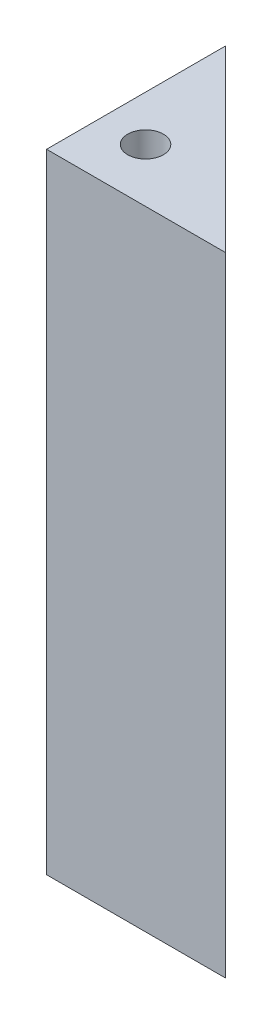
ISO-10303-21;
HEADER;
FILE_DESCRIPTION(('STEP AP214'),'2;1');
FILE_NAME('part.step','',(''),(''),'','','');
FILE_SCHEMA(('AUTOMOTIVE_DESIGN { 1 0 10303 214 1 1 1 1 }'));
ENDSEC;
DATA;
#1=APPLICATION_CONTEXT('core data for automotive mechanical design processes');
#2=APPLICATION_PROTOCOL_DEFINITION('international standard','automotive_design',2000,#1);
#3=PRODUCT_CONTEXT('',#1,'mechanical');
#4=PRODUCT('Part','Part','',(#3));
#5=PRODUCT_RELATED_PRODUCT_CATEGORY('part','',(#4));
#6=PRODUCT_DEFINITION_FORMATION('','',#4);
#7=PRODUCT_DEFINITION_CONTEXT('part definition',#1,'design');
#8=PRODUCT_DEFINITION('design','',#6,#7);
#9=PRODUCT_DEFINITION_SHAPE('','',#8);
#10=(LENGTH_UNIT() NAMED_UNIT(*) SI_UNIT(.MILLI.,.METRE.));
#11=(NAMED_UNIT(*) PLANE_ANGLE_UNIT() SI_UNIT($,.RADIAN.));
#12=(NAMED_UNIT(*) SI_UNIT($,.STERADIAN.) SOLID_ANGLE_UNIT());
#13=UNCERTAINTY_MEASURE_WITH_UNIT(LENGTH_MEASURE(1.E-05),#10,'distance_accuracy_value','');
#14=(GEOMETRIC_REPRESENTATION_CONTEXT(3) GLOBAL_UNCERTAINTY_ASSIGNED_CONTEXT((#13)) GLOBAL_UNIT_ASSIGNED_CONTEXT((#10,
#11,#12)) REPRESENTATION_CONTEXT('',''));
#15=CARTESIAN_POINT('',(0.,0.,0.));
#16=DIRECTION('',(0.,0.,1.));
#17=DIRECTION('',(1.,0.,0.));
#18=AXIS2_PLACEMENT_3D('',#15,#16,#17);
#19=CARTESIAN_POINT('',(0.,5.,0.));
#20=DIRECTION('',(0.,1.,0.));
#21=DIRECTION('',(0.,0.,1.));
#22=AXIS2_PLACEMENT_3D('',#19,#20,#21);
#23=PLANE('',#22);
#24=DIRECTION('',(-0.707106781186547,0.,-0.707106781186547));
#25=VECTOR('',#24,1.);
#26=CARTESIAN_POINT('',(15.,5.,15.));
#27=LINE('',#26,#25);
#28=CARTESIAN_POINT('',(15.,5.,15.));
#29=VERTEX_POINT('',#28);
#30=CARTESIAN_POINT('',(0.,5.,0.));
#31=VERTEX_POINT('',#30);
#32=EDGE_CURVE('E75',#29,#31,#27,.T.);
#33=ORIENTED_EDGE('',*,*,#32,.T.);
#34=DIRECTION('',(0.,0.,1.));
#35=VECTOR('',#34,1.);
#36=CARTESIAN_POINT('',(0.,5.,0.));
#37=LINE('',#36,#35);
#38=CARTESIAN_POINT('',(0.,5.,15.));
#39=VERTEX_POINT('',#38);
#40=EDGE_CURVE('E55',#31,#39,#37,.T.);
#41=ORIENTED_EDGE('',*,*,#40,.T.);
#42=DIRECTION('',(1.,0.,0.));
#43=VECTOR('',#42,1.);
#44=CARTESIAN_POINT('',(0.,5.,15.));
#45=LINE('',#44,#43);
#46=EDGE_CURVE('E51',#39,#29,#45,.T.);
#47=ORIENTED_EDGE('',*,*,#46,.T.);
#48=EDGE_LOOP('',(#33,#41,#47));
#49=FACE_BOUND('',#48,.T.);
#50=CARTESIAN_POINT('',(3.8,5.,10.5));
#51=DIRECTION('',(0.,1.,0.));
#52=DIRECTION('',(0.,0.,1.));
#53=AXIS2_PLACEMENT_3D('',#50,#51,#52);
#54=CIRCLE('',#53,1.5);
#55=CARTESIAN_POINT('',(3.8,5.,12.));
#56=VERTEX_POINT('',#55);
#57=EDGE_CURVE('E95',#56,#56,#54,.T.);
#58=ORIENTED_EDGE('',*,*,#57,.F.);
#59=EDGE_LOOP('',(#58));
#60=FACE_BOUND('',#59,.T.);
#61=ADVANCED_FACE('F35',(#49,#60),#23,.T.);
#62=CARTESIAN_POINT('',(15.,5.,15.));
#63=DIRECTION('',(-0.707106781186548,0.,0.707106781186548));
#64=DIRECTION('',(0.707106781186548,0.,0.707106781186548));
#65=AXIS2_PLACEMENT_3D('',#62,#63,#64);
#66=PLANE('',#65);
#67=DIRECTION('',(0.,-1.,0.));
#68=VECTOR('',#67,1.);
#69=CARTESIAN_POINT('',(15.,5.,15.));
#70=LINE('',#69,#68);
#71=CARTESIAN_POINT('',(15.,-47.7,15.));
#72=VERTEX_POINT('',#71);
#73=EDGE_CURVE('E70',#29,#72,#70,.T.);
#74=ORIENTED_EDGE('',*,*,#73,.T.);
#75=DIRECTION('',(-0.707106781186548,0.,-0.707106781186548));
#76=VECTOR('',#75,1.);
#77=CARTESIAN_POINT('',(0.,-47.7,0.));
#78=LINE('',#77,#76);
#79=CARTESIAN_POINT('',(0.,-47.7,0.));
#80=VERTEX_POINT('',#79);
#81=EDGE_CURVE('E73',#72,#80,#78,.T.);
#82=ORIENTED_EDGE('',*,*,#81,.T.);
#83=DIRECTION('',(0.,-1.,0.));
#84=VECTOR('',#83,1.);
#85=CARTESIAN_POINT('',(0.,5.,0.));
#86=LINE('',#85,#84);
#87=EDGE_CURVE('E39',#31,#80,#86,.T.);
#88=ORIENTED_EDGE('',*,*,#87,.F.);
#89=ORIENTED_EDGE('',*,*,#32,.F.);
#90=EDGE_LOOP('',(#74,#82,#88,#89));
#91=FACE_BOUND('',#90,.T.);
#92=ADVANCED_FACE('F37',(#91),#66,.F.);
#93=CARTESIAN_POINT('',(0.,5.,0.));
#94=DIRECTION('',(1.,0.,0.));
#95=DIRECTION('',(0.,0.,-1.));
#96=AXIS2_PLACEMENT_3D('',#93,#94,#95);
#97=PLANE('',#96);
#98=ORIENTED_EDGE('',*,*,#87,.T.);
#99=DIRECTION('',(0.,0.,1.));
#100=VECTOR('',#99,1.);
#101=CARTESIAN_POINT('',(0.,-47.7,0.));
#102=LINE('',#101,#100);
#103=CARTESIAN_POINT('',(0.,-47.7,15.));
#104=VERTEX_POINT('',#103);
#105=EDGE_CURVE('E85',#80,#104,#102,.T.);
#106=ORIENTED_EDGE('',*,*,#105,.T.);
#107=DIRECTION('',(0.,-1.,0.));
#108=VECTOR('',#107,1.);
#109=CARTESIAN_POINT('',(0.,5.,15.));
#110=LINE('',#109,#108);
#111=EDGE_CURVE('E78',#39,#104,#110,.T.);
#112=ORIENTED_EDGE('',*,*,#111,.F.);
#113=ORIENTED_EDGE('',*,*,#40,.F.);
#114=EDGE_LOOP('',(#98,#106,#112,#113));
#115=FACE_BOUND('',#114,.T.);
#116=ADVANCED_FACE('F103',(#115),#97,.F.);
#117=CARTESIAN_POINT('',(0.,5.,15.));
#118=DIRECTION('',(0.,0.,-1.));
#119=DIRECTION('',(-1.,0.,0.));
#120=AXIS2_PLACEMENT_3D('',#117,#118,#119);
#121=PLANE('',#120);
#122=ORIENTED_EDGE('',*,*,#111,.T.);
#123=DIRECTION('',(1.,0.,0.));
#124=VECTOR('',#123,1.);
#125=CARTESIAN_POINT('',(0.,-47.7,15.));
#126=LINE('',#125,#124);
#127=EDGE_CURVE('E83',#104,#72,#126,.T.);
#128=ORIENTED_EDGE('',*,*,#127,.T.);
#129=ORIENTED_EDGE('',*,*,#73,.F.);
#130=ORIENTED_EDGE('',*,*,#46,.F.);
#131=EDGE_LOOP('',(#122,#128,#129,#130));
#132=FACE_BOUND('',#131,.T.);
#133=ADVANCED_FACE('F87',(#132),#121,.F.);
#134=CARTESIAN_POINT('',(3.8,5.,10.5));
#135=DIRECTION('',(0.,-1.,0.));
#136=DIRECTION('',(0.,0.,-1.));
#137=AXIS2_PLACEMENT_3D('',#134,#135,#136);
#138=CYLINDRICAL_SURFACE('',#137,1.5);
#139=ORIENTED_EDGE('',*,*,#57,.T.);
#140=EDGE_LOOP('',(#139));
#141=FACE_BOUND('',#140,.T.);
#142=CARTESIAN_POINT('',(3.8,0.,10.5));
#143=DIRECTION('',(0.,1.,0.));
#144=DIRECTION('',(0.,0.,1.));
#145=AXIS2_PLACEMENT_3D('',#142,#143,#144);
#146=CIRCLE('',#145,1.5);
#147=CARTESIAN_POINT('',(3.8,0.,12.));
#148=VERTEX_POINT('',#147);
#149=EDGE_CURVE('E93',#148,#148,#146,.T.);
#150=ORIENTED_EDGE('',*,*,#149,.F.);
#151=EDGE_LOOP('',(#150));
#152=FACE_BOUND('',#151,.T.);
#153=ADVANCED_FACE('F109',(#141,#152),#138,.F.);
#154=CARTESIAN_POINT('',(0.,0.,0.));
#155=DIRECTION('',(0.,1.,0.));
#156=DIRECTION('',(0.,0.,1.));
#157=AXIS2_PLACEMENT_3D('',#154,#155,#156);
#158=PLANE('',#157);
#159=ORIENTED_EDGE('',*,*,#149,.T.);
#160=EDGE_LOOP('',(#159));
#161=FACE_BOUND('',#160,.T.);
#162=ADVANCED_FACE('F112',(#161),#158,.T.);
#163=CARTESIAN_POINT('',(3.8,-47.7,10.5));
#164=DIRECTION('',(0.,1.,0.));
#165=DIRECTION('',(0.,0.,1.));
#166=AXIS2_PLACEMENT_3D('',#163,#164,#165);
#167=CYLINDRICAL_SURFACE('',#166,1.5);
#168=CARTESIAN_POINT('',(3.8,-47.7,10.5));
#169=DIRECTION('',(0.,1.,0.));
#170=DIRECTION('',(0.,0.,1.));
#171=AXIS2_PLACEMENT_3D('',#168,#169,#170);
#172=CIRCLE('',#171,1.5);
#173=CARTESIAN_POINT('',(3.8,-47.7,12.));
#174=VERTEX_POINT('',#173);
#175=EDGE_CURVE('E88',#174,#174,#172,.T.);
#176=ORIENTED_EDGE('',*,*,#175,.F.);
#177=EDGE_LOOP('',(#176));
#178=FACE_BOUND('',#177,.T.);
#179=CARTESIAN_POINT('',(3.8,-42.7,10.5));
#180=DIRECTION('',(0.,1.,0.));
#181=DIRECTION('',(0.,0.,1.));
#182=AXIS2_PLACEMENT_3D('',#179,#180,#181);
#183=CIRCLE('',#182,1.5);
#184=CARTESIAN_POINT('',(3.8,-42.7,12.));
#185=VERTEX_POINT('',#184);
#186=EDGE_CURVE('E11',#185,#185,#183,.T.);
#187=ORIENTED_EDGE('',*,*,#186,.T.);
#188=EDGE_LOOP('',(#187));
#189=FACE_BOUND('',#188,.T.);
#190=ADVANCED_FACE('F117',(#178,#189),#167,.F.);
#191=CARTESIAN_POINT('',(0.,-47.7,0.));
#192=DIRECTION('',(0.,1.,0.));
#193=DIRECTION('',(0.,0.,1.));
#194=AXIS2_PLACEMENT_3D('',#191,#192,#193);
#195=PLANE('',#194);
#196=ORIENTED_EDGE('',*,*,#175,.T.);
#197=EDGE_LOOP('',(#196));
#198=FACE_BOUND('',#197,.T.);
#199=ORIENTED_EDGE('',*,*,#127,.F.);
#200=ORIENTED_EDGE('',*,*,#105,.F.);
#201=ORIENTED_EDGE('',*,*,#81,.F.);
#202=EDGE_LOOP('',(#199,#200,#201));
#203=FACE_BOUND('',#202,.T.);
#204=ADVANCED_FACE('F82',(#198,#203),#195,.F.);
#205=CARTESIAN_POINT('',(0.,-42.7,0.));
#206=DIRECTION('',(0.,1.,0.));
#207=DIRECTION('',(0.,0.,1.));
#208=AXIS2_PLACEMENT_3D('',#205,#206,#207);
#209=PLANE('',#208);
#210=ORIENTED_EDGE('',*,*,#186,.F.);
#211=EDGE_LOOP('',(#210));
#212=FACE_BOUND('',#211,.T.);
#213=ADVANCED_FACE('F125',(#212),#209,.F.);
#214=CLOSED_SHELL('',(#61,#92,#116,#133,#153,#162,#190,#204,#213));
#215=MANIFOLD_SOLID_BREP('B2',#214);
#216=ADVANCED_BREP_SHAPE_REPRESENTATION('',(#18,#215),#14);
#217=SHAPE_DEFINITION_REPRESENTATION(#9,#216);
ENDSEC;
END-ISO-10303-21;
